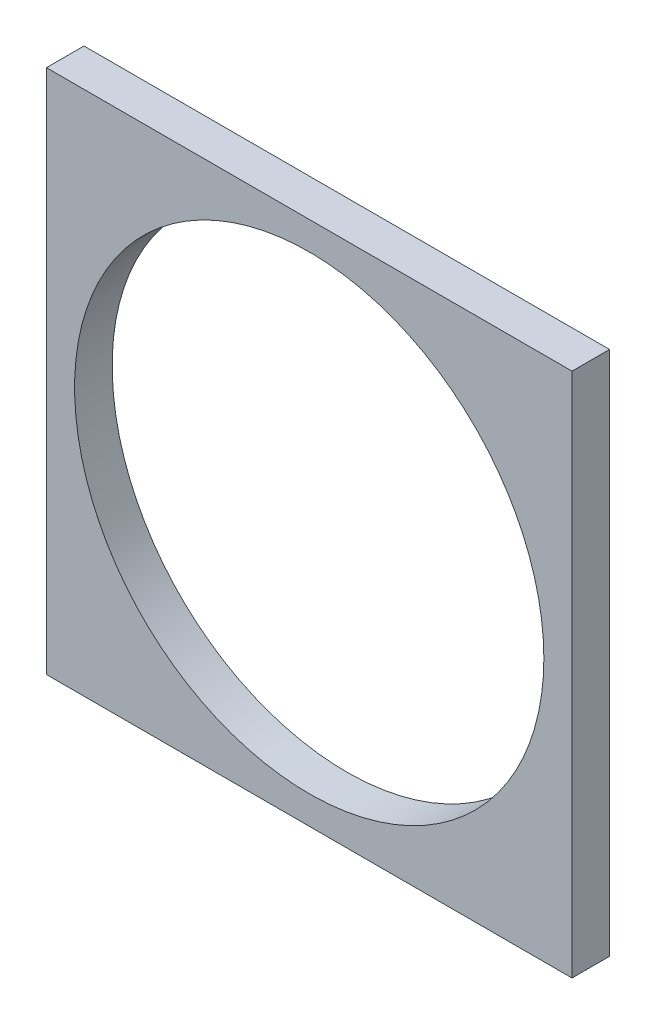
ISO-10303-21;
HEADER;
FILE_DESCRIPTION(('STEP AP214'),'2;1');
FILE_NAME('part.step','',(''),(''),'','','');
FILE_SCHEMA(('AUTOMOTIVE_DESIGN { 1 0 10303 214 1 1 1 1 }'));
ENDSEC;
DATA;
#1=APPLICATION_CONTEXT('core data for automotive mechanical design processes');
#2=APPLICATION_PROTOCOL_DEFINITION('international standard','automotive_design',2000,#1);
#3=PRODUCT_CONTEXT('',#1,'mechanical');
#4=PRODUCT('Part','Part','',(#3));
#5=PRODUCT_RELATED_PRODUCT_CATEGORY('part','',(#4));
#6=PRODUCT_DEFINITION_FORMATION('','',#4);
#7=PRODUCT_DEFINITION_CONTEXT('part definition',#1,'design');
#8=PRODUCT_DEFINITION('design','',#6,#7);
#9=PRODUCT_DEFINITION_SHAPE('','',#8);
#10=(LENGTH_UNIT() NAMED_UNIT(*) SI_UNIT(.MILLI.,.METRE.));
#11=(NAMED_UNIT(*) PLANE_ANGLE_UNIT() SI_UNIT($,.RADIAN.));
#12=(NAMED_UNIT(*) SI_UNIT($,.STERADIAN.) SOLID_ANGLE_UNIT());
#13=UNCERTAINTY_MEASURE_WITH_UNIT(LENGTH_MEASURE(1.E-05),#10,'distance_accuracy_value','');
#14=(GEOMETRIC_REPRESENTATION_CONTEXT(3) GLOBAL_UNCERTAINTY_ASSIGNED_CONTEXT((#13)) GLOBAL_UNIT_ASSIGNED_CONTEXT((#10,
#11,#12)) REPRESENTATION_CONTEXT('',''));
#15=CARTESIAN_POINT('',(0.,0.,0.));
#16=DIRECTION('',(0.,0.,1.));
#17=DIRECTION('',(1.,0.,0.));
#18=AXIS2_PLACEMENT_3D('',#15,#16,#17);
#19=CARTESIAN_POINT('',(0.,0.,1.));
#20=DIRECTION('',(0.,0.,1.));
#21=DIRECTION('',(1.,0.,0.));
#22=AXIS2_PLACEMENT_3D('',#19,#20,#21);
#23=PLANE('',#22);
#24=DIRECTION('',(0.,1.,0.));
#25=VECTOR('',#24,1.);
#26=CARTESIAN_POINT('',(7.,7.,1.));
#27=LINE('',#26,#25);
#28=CARTESIAN_POINT('',(7.,-7.,1.));
#29=VERTEX_POINT('',#28);
#30=CARTESIAN_POINT('',(7.,7.,1.));
#31=VERTEX_POINT('',#30);
#32=EDGE_CURVE('E92',#29,#31,#27,.T.);
#33=ORIENTED_EDGE('',*,*,#32,.T.);
#34=DIRECTION('',(-1.,0.,0.));
#35=VECTOR('',#34,1.);
#36=CARTESIAN_POINT('',(-7.,7.,1.));
#37=LINE('',#36,#35);
#38=CARTESIAN_POINT('',(-7.,7.,1.));
#39=VERTEX_POINT('',#38);
#40=EDGE_CURVE('E87',#31,#39,#37,.T.);
#41=ORIENTED_EDGE('',*,*,#40,.T.);
#42=DIRECTION('',(0.,-1.,0.));
#43=VECTOR('',#42,1.);
#44=CARTESIAN_POINT('',(-7.,7.,1.));
#45=LINE('',#44,#43);
#46=CARTESIAN_POINT('',(-7.,-7.,1.));
#47=VERTEX_POINT('',#46);
#48=EDGE_CURVE('E90',#39,#47,#45,.T.);
#49=ORIENTED_EDGE('',*,*,#48,.T.);
#50=DIRECTION('',(1.,0.,0.));
#51=VECTOR('',#50,1.);
#52=CARTESIAN_POINT('',(-7.,-7.,1.));
#53=LINE('',#52,#51);
#54=EDGE_CURVE('E57',#47,#29,#53,.T.);
#55=ORIENTED_EDGE('',*,*,#54,.T.);
#56=EDGE_LOOP('',(#33,#41,#49,#55));
#57=FACE_BOUND('',#56,.T.);
#58=CARTESIAN_POINT('',(0.,0.,1.));
#59=DIRECTION('',(0.,0.,1.));
#60=DIRECTION('',(1.,0.,0.));
#61=AXIS2_PLACEMENT_3D('',#58,#59,#60);
#62=CIRCLE('',#61,6.25);
#63=CARTESIAN_POINT('',(6.25,0.,1.));
#64=VERTEX_POINT('',#63);
#65=EDGE_CURVE('E112',#64,#64,#62,.T.);
#66=ORIENTED_EDGE('',*,*,#65,.F.);
#67=EDGE_LOOP('',(#66));
#68=FACE_BOUND('',#67,.T.);
#69=ADVANCED_FACE('F39',(#57,#68),#23,.T.);
#70=CARTESIAN_POINT('',(0.,0.,0.));
#71=DIRECTION('',(0.,0.,1.));
#72=DIRECTION('',(1.,0.,0.));
#73=AXIS2_PLACEMENT_3D('',#70,#71,#72);
#74=PLANE('',#73);
#75=DIRECTION('',(0.,1.,0.));
#76=VECTOR('',#75,1.);
#77=CARTESIAN_POINT('',(7.,7.,0.));
#78=LINE('',#77,#76);
#79=CARTESIAN_POINT('',(7.,-7.,0.));
#80=VERTEX_POINT('',#79);
#81=CARTESIAN_POINT('',(7.,7.,0.));
#82=VERTEX_POINT('',#81);
#83=EDGE_CURVE('E108',#80,#82,#78,.T.);
#84=ORIENTED_EDGE('',*,*,#83,.F.);
#85=DIRECTION('',(1.,0.,0.));
#86=VECTOR('',#85,1.);
#87=CARTESIAN_POINT('',(-7.,-7.,0.));
#88=LINE('',#87,#86);
#89=CARTESIAN_POINT('',(-7.,-7.,0.));
#90=VERTEX_POINT('',#89);
#91=EDGE_CURVE('E80',#90,#80,#88,.T.);
#92=ORIENTED_EDGE('',*,*,#91,.F.);
#93=DIRECTION('',(0.,-1.,0.));
#94=VECTOR('',#93,1.);
#95=CARTESIAN_POINT('',(-7.,7.,0.));
#96=LINE('',#95,#94);
#97=CARTESIAN_POINT('',(-7.,7.,0.));
#98=VERTEX_POINT('',#97);
#99=EDGE_CURVE('E74',#98,#90,#96,.T.);
#100=ORIENTED_EDGE('',*,*,#99,.F.);
#101=DIRECTION('',(-1.,0.,0.));
#102=VECTOR('',#101,1.);
#103=CARTESIAN_POINT('',(-7.,7.,0.));
#104=LINE('',#103,#102);
#105=EDGE_CURVE('E97',#82,#98,#104,.T.);
#106=ORIENTED_EDGE('',*,*,#105,.F.);
#107=EDGE_LOOP('',(#84,#92,#100,#106));
#108=FACE_BOUND('',#107,.T.);
#109=CARTESIAN_POINT('',(0.,0.,0.));
#110=DIRECTION('',(0.,0.,1.));
#111=DIRECTION('',(1.,0.,0.));
#112=AXIS2_PLACEMENT_3D('',#109,#110,#111);
#113=CIRCLE('',#112,6.25);
#114=CARTESIAN_POINT('',(6.25,0.,0.));
#115=VERTEX_POINT('',#114);
#116=EDGE_CURVE('E130',#115,#115,#113,.T.);
#117=ORIENTED_EDGE('',*,*,#116,.T.);
#118=EDGE_LOOP('',(#117));
#119=FACE_BOUND('',#118,.T.);
#120=ADVANCED_FACE('F125',(#108,#119),#74,.F.);
#121=CARTESIAN_POINT('',(7.,7.,1.));
#122=DIRECTION('',(-1.,0.,0.));
#123=DIRECTION('',(0.,0.,1.));
#124=AXIS2_PLACEMENT_3D('',#121,#122,#123);
#125=PLANE('',#124);
#126=ORIENTED_EDGE('',*,*,#83,.T.);
#127=DIRECTION('',(0.,0.,-1.));
#128=VECTOR('',#127,1.);
#129=CARTESIAN_POINT('',(7.,7.,1.));
#130=LINE('',#129,#128);
#131=EDGE_CURVE('E11',#31,#82,#130,.T.);
#132=ORIENTED_EDGE('',*,*,#131,.F.);
#133=ORIENTED_EDGE('',*,*,#32,.F.);
#134=DIRECTION('',(0.,0.,-1.));
#135=VECTOR('',#134,1.);
#136=CARTESIAN_POINT('',(7.,-7.,1.));
#137=LINE('',#136,#135);
#138=EDGE_CURVE('E104',#29,#80,#137,.T.);
#139=ORIENTED_EDGE('',*,*,#138,.T.);
#140=EDGE_LOOP('',(#126,#132,#133,#139));
#141=FACE_BOUND('',#140,.T.);
#142=ADVANCED_FACE('F41',(#141),#125,.F.);
#143=CARTESIAN_POINT('',(-7.,7.,1.));
#144=DIRECTION('',(0.,-1.,0.));
#145=DIRECTION('',(0.,0.,-1.));
#146=AXIS2_PLACEMENT_3D('',#143,#144,#145);
#147=PLANE('',#146);
#148=ORIENTED_EDGE('',*,*,#105,.T.);
#149=DIRECTION('',(0.,0.,-1.));
#150=VECTOR('',#149,1.);
#151=CARTESIAN_POINT('',(-7.,7.,1.));
#152=LINE('',#151,#150);
#153=EDGE_CURVE('E49',#39,#98,#152,.T.);
#154=ORIENTED_EDGE('',*,*,#153,.F.);
#155=ORIENTED_EDGE('',*,*,#40,.F.);
#156=ORIENTED_EDGE('',*,*,#131,.T.);
#157=EDGE_LOOP('',(#148,#154,#155,#156));
#158=FACE_BOUND('',#157,.T.);
#159=ADVANCED_FACE('F96',(#158),#147,.F.);
#160=CARTESIAN_POINT('',(-7.,7.,1.));
#161=DIRECTION('',(1.,0.,0.));
#162=DIRECTION('',(0.,0.,-1.));
#163=AXIS2_PLACEMENT_3D('',#160,#161,#162);
#164=PLANE('',#163);
#165=ORIENTED_EDGE('',*,*,#99,.T.);
#166=DIRECTION('',(0.,0.,-1.));
#167=VECTOR('',#166,1.);
#168=CARTESIAN_POINT('',(-7.,-7.,1.));
#169=LINE('',#168,#167);
#170=EDGE_CURVE('E99',#47,#90,#169,.T.);
#171=ORIENTED_EDGE('',*,*,#170,.F.);
#172=ORIENTED_EDGE('',*,*,#48,.F.);
#173=ORIENTED_EDGE('',*,*,#153,.T.);
#174=EDGE_LOOP('',(#165,#171,#172,#173));
#175=FACE_BOUND('',#174,.T.);
#176=ADVANCED_FACE('F100',(#175),#164,.F.);
#177=CARTESIAN_POINT('',(-7.,-7.,1.));
#178=DIRECTION('',(0.,1.,0.));
#179=DIRECTION('',(0.,0.,1.));
#180=AXIS2_PLACEMENT_3D('',#177,#178,#179);
#181=PLANE('',#180);
#182=ORIENTED_EDGE('',*,*,#91,.T.);
#183=ORIENTED_EDGE('',*,*,#138,.F.);
#184=ORIENTED_EDGE('',*,*,#54,.F.);
#185=ORIENTED_EDGE('',*,*,#170,.T.);
#186=EDGE_LOOP('',(#182,#183,#184,#185));
#187=FACE_BOUND('',#186,.T.);
#188=ADVANCED_FACE('F122',(#187),#181,.F.);
#189=CARTESIAN_POINT('',(0.,0.,1.));
#190=DIRECTION('',(0.,0.,-1.));
#191=DIRECTION('',(-1.,0.,0.));
#192=AXIS2_PLACEMENT_3D('',#189,#190,#191);
#193=CYLINDRICAL_SURFACE('',#192,6.25);
#194=ORIENTED_EDGE('',*,*,#65,.T.);
#195=EDGE_LOOP('',(#194));
#196=FACE_BOUND('',#195,.T.);
#197=ORIENTED_EDGE('',*,*,#116,.F.);
#198=EDGE_LOOP('',(#197));
#199=FACE_BOUND('',#198,.T.);
#200=ADVANCED_FACE('F138',(#196,#199),#193,.F.);
#201=CLOSED_SHELL('',(#69,#120,#142,#159,#176,#188,#200));
#202=MANIFOLD_SOLID_BREP('B2',#201);
#203=ADVANCED_BREP_SHAPE_REPRESENTATION('',(#18,#202),#14);
#204=SHAPE_DEFINITION_REPRESENTATION(#9,#203);
ENDSEC;
END-ISO-10303-21;
